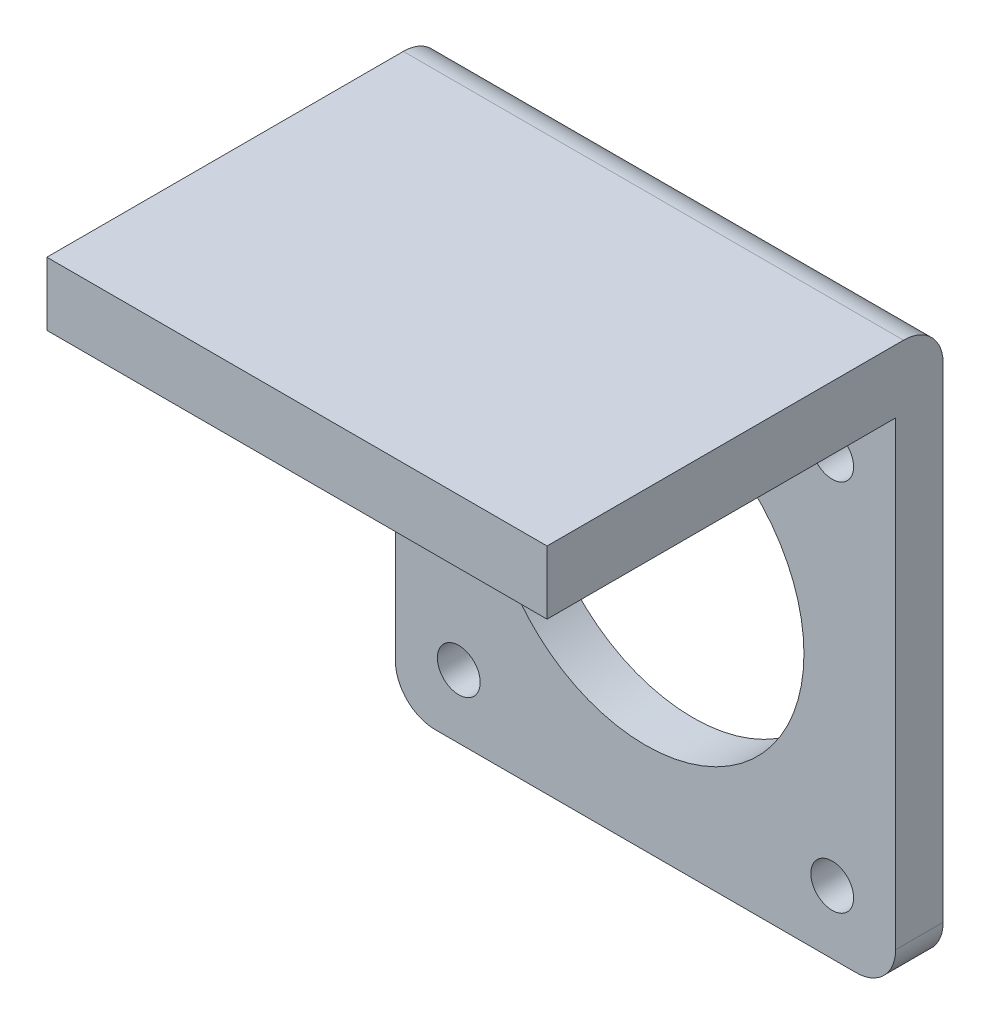
ISO-10303-21;
HEADER;
FILE_DESCRIPTION(('STEP AP214'),'2;1');
FILE_NAME('part.step','',(''),(''),'','','');
FILE_SCHEMA(('AUTOMOTIVE_DESIGN { 1 0 10303 214 1 1 1 1 }'));
ENDSEC;
DATA;
#1=APPLICATION_CONTEXT('core data for automotive mechanical design processes');
#2=APPLICATION_PROTOCOL_DEFINITION('international standard','automotive_design',2000,#1);
#3=PRODUCT_CONTEXT('',#1,'mechanical');
#4=PRODUCT('Part','Part','',(#3));
#5=PRODUCT_RELATED_PRODUCT_CATEGORY('part','',(#4));
#6=PRODUCT_DEFINITION_FORMATION('','',#4);
#7=PRODUCT_DEFINITION_CONTEXT('part definition',#1,'design');
#8=PRODUCT_DEFINITION('design','',#6,#7);
#9=PRODUCT_DEFINITION_SHAPE('','',#8);
#10=(LENGTH_UNIT() NAMED_UNIT(*) SI_UNIT(.MILLI.,.METRE.));
#11=(NAMED_UNIT(*) PLANE_ANGLE_UNIT() SI_UNIT($,.RADIAN.));
#12=(NAMED_UNIT(*) SI_UNIT($,.STERADIAN.) SOLID_ANGLE_UNIT());
#13=UNCERTAINTY_MEASURE_WITH_UNIT(LENGTH_MEASURE(1.E-05),#10,'distance_accuracy_value','');
#14=(GEOMETRIC_REPRESENTATION_CONTEXT(3) GLOBAL_UNCERTAINTY_ASSIGNED_CONTEXT((#13)) GLOBAL_UNIT_ASSIGNED_CONTEXT((#10,
#11,#12)) REPRESENTATION_CONTEXT('',''));
#15=CARTESIAN_POINT('',(0.,0.,0.));
#16=DIRECTION('',(0.,0.,1.));
#17=DIRECTION('',(1.,0.,0.));
#18=AXIS2_PLACEMENT_3D('',#15,#16,#17);
#19=CARTESIAN_POINT('',(-8.,0.,6.));
#20=DIRECTION('',(-1.,0.,0.));
#21=DIRECTION('',(0.,0.,1.));
#22=AXIS2_PLACEMENT_3D('',#19,#20,#21);
#23=PLANE('',#22);
#24=DIRECTION('',(0.,0.,-1.));
#25=VECTOR('',#24,1.);
#26=CARTESIAN_POINT('',(-8.,16.,50.));
#27=LINE('',#26,#25);
#28=CARTESIAN_POINT('',(-8.,16.,50.));
#29=VERTEX_POINT('',#28);
#30=CARTESIAN_POINT('',(-8.,16.,5.));
#31=VERTEX_POINT('',#30);
#32=EDGE_CURVE('E148',#29,#31,#27,.T.);
#33=ORIENTED_EDGE('',*,*,#32,.T.);
#34=CARTESIAN_POINT('',(-8.,11.,5.));
#35=DIRECTION('',(-1.,0.,0.));
#36=DIRECTION('',(0.,0.,1.));
#37=AXIS2_PLACEMENT_3D('',#34,#35,#36);
#38=CIRCLE('',#37,5.);
#39=CARTESIAN_POINT('',(-8.,11.,0.));
#40=VERTEX_POINT('',#39);
#41=EDGE_CURVE('E11',#31,#40,#38,.T.);
#42=ORIENTED_EDGE('',*,*,#41,.T.);
#43=DIRECTION('',(0.,1.,0.));
#44=VECTOR('',#43,1.);
#45=CARTESIAN_POINT('',(-8.,0.,0.));
#46=LINE('',#45,#44);
#47=CARTESIAN_POINT('',(-8.,-50.14,0.));
#48=VERTEX_POINT('',#47);
#49=EDGE_CURVE('E209',#48,#40,#46,.T.);
#50=ORIENTED_EDGE('',*,*,#49,.F.);
#51=DIRECTION('',(0.,0.,-1.));
#52=VECTOR('',#51,1.);
#53=CARTESIAN_POINT('',(-8.,-50.14,6.));
#54=LINE('',#53,#52);
#55=CARTESIAN_POINT('',(-8.,-50.14,6.));
#56=VERTEX_POINT('',#55);
#57=EDGE_CURVE('E240',#56,#48,#54,.T.);
#58=ORIENTED_EDGE('',*,*,#57,.F.);
#59=DIRECTION('',(0.,1.,0.));
#60=VECTOR('',#59,1.);
#61=CARTESIAN_POINT('',(-8.,0.,6.));
#62=LINE('',#61,#60);
#63=CARTESIAN_POINT('',(-8.,8.,6.));
#64=VERTEX_POINT('',#63);
#65=EDGE_CURVE('E170',#56,#64,#62,.T.);
#66=ORIENTED_EDGE('',*,*,#65,.T.);
#67=DIRECTION('',(0.,0.,-1.));
#68=VECTOR('',#67,1.);
#69=CARTESIAN_POINT('',(-8.,8.,50.));
#70=LINE('',#69,#68);
#71=CARTESIAN_POINT('',(-8.,8.,50.));
#72=VERTEX_POINT('',#71);
#73=EDGE_CURVE('E122',#72,#64,#70,.T.);
#74=ORIENTED_EDGE('',*,*,#73,.F.);
#75=DIRECTION('',(0.,1.,0.));
#76=VECTOR('',#75,1.);
#77=CARTESIAN_POINT('',(-8.,8.,50.));
#78=LINE('',#77,#76);
#79=EDGE_CURVE('E133',#72,#29,#78,.T.);
#80=ORIENTED_EDGE('',*,*,#79,.T.);
#81=EDGE_LOOP('',(#33,#42,#50,#58,#66,#74,#80));
#82=FACE_BOUND('',#81,.T.);
#83=ADVANCED_FACE('F41',(#82),#23,.T.);
#84=CARTESIAN_POINT('',(-3.,-50.14,6.));
#85=DIRECTION('',(0.,0.,-1.));
#86=DIRECTION('',(-1.,0.,0.));
#87=AXIS2_PLACEMENT_3D('',#84,#85,#86);
#88=CYLINDRICAL_SURFACE('',#87,5.);
#89=CARTESIAN_POINT('',(-3.,-50.14,0.));
#90=DIRECTION('',(0.,0.,1.));
#91=DIRECTION('',(1.,0.,0.));
#92=AXIS2_PLACEMENT_3D('',#89,#90,#91);
#93=CIRCLE('',#92,5.);
#94=CARTESIAN_POINT('',(-2.99999999999996,-55.14,0.));
#95=VERTEX_POINT('',#94);
#96=EDGE_CURVE('E213',#48,#95,#93,.T.);
#97=ORIENTED_EDGE('',*,*,#96,.T.);
#98=DIRECTION('',(0.,0.,-1.));
#99=VECTOR('',#98,1.);
#100=CARTESIAN_POINT('',(-2.99999999999996,-55.14,6.));
#101=LINE('',#100,#99);
#102=CARTESIAN_POINT('',(-2.99999999999996,-55.14,6.));
#103=VERTEX_POINT('',#102);
#104=EDGE_CURVE('E236',#103,#95,#101,.T.);
#105=ORIENTED_EDGE('',*,*,#104,.F.);
#106=CARTESIAN_POINT('',(-3.,-50.14,6.));
#107=DIRECTION('',(0.,0.,1.));
#108=DIRECTION('',(1.,0.,0.));
#109=AXIS2_PLACEMENT_3D('',#106,#107,#108);
#110=CIRCLE('',#109,5.);
#111=EDGE_CURVE('E173',#56,#103,#110,.T.);
#112=ORIENTED_EDGE('',*,*,#111,.F.);
#113=ORIENTED_EDGE('',*,*,#57,.T.);
#114=EDGE_LOOP('',(#97,#105,#112,#113));
#115=FACE_BOUND('',#114,.T.);
#116=ADVANCED_FACE('F268',(#115),#88,.T.);
#117=CARTESIAN_POINT('',(0.,-55.14,6.));
#118=DIRECTION('',(0.,1.,0.));
#119=DIRECTION('',(0.,0.,1.));
#120=AXIS2_PLACEMENT_3D('',#117,#118,#119);
#121=PLANE('',#120);
#122=DIRECTION('',(1.,0.,0.));
#123=VECTOR('',#122,1.);
#124=CARTESIAN_POINT('',(0.,-55.14,0.));
#125=LINE('',#124,#123);
#126=CARTESIAN_POINT('',(50.1400000000005,-55.14,0.));
#127=VERTEX_POINT('',#126);
#128=EDGE_CURVE('E217',#95,#127,#125,.T.);
#129=ORIENTED_EDGE('',*,*,#128,.T.);
#130=DIRECTION('',(0.,0.,-1.));
#131=VECTOR('',#130,1.);
#132=CARTESIAN_POINT('',(50.1400000000005,-55.14,6.));
#133=LINE('',#132,#131);
#134=CARTESIAN_POINT('',(50.1400000000005,-55.14,6.));
#135=VERTEX_POINT('',#134);
#136=EDGE_CURVE('E233',#135,#127,#133,.T.);
#137=ORIENTED_EDGE('',*,*,#136,.F.);
#138=DIRECTION('',(1.,0.,0.));
#139=VECTOR('',#138,1.);
#140=CARTESIAN_POINT('',(0.,-55.14,6.));
#141=LINE('',#140,#139);
#142=EDGE_CURVE('E177',#103,#135,#141,.T.);
#143=ORIENTED_EDGE('',*,*,#142,.F.);
#144=ORIENTED_EDGE('',*,*,#104,.T.);
#145=EDGE_LOOP('',(#129,#137,#143,#144));
#146=FACE_BOUND('',#145,.T.);
#147=ADVANCED_FACE('F265',(#146),#121,.F.);
#148=CARTESIAN_POINT('',(50.1400000000005,-50.14,6.));
#149=DIRECTION('',(0.,0.,-1.));
#150=DIRECTION('',(-1.,0.,0.));
#151=AXIS2_PLACEMENT_3D('',#148,#149,#150);
#152=CYLINDRICAL_SURFACE('',#151,5.);
#153=CARTESIAN_POINT('',(50.1400000000005,-50.14,0.));
#154=DIRECTION('',(0.,0.,1.));
#155=DIRECTION('',(1.,0.,0.));
#156=AXIS2_PLACEMENT_3D('',#153,#154,#155);
#157=CIRCLE('',#156,5.);
#158=CARTESIAN_POINT('',(55.1400000000005,-50.14,0.));
#159=VERTEX_POINT('',#158);
#160=EDGE_CURVE('E221',#159,#127,#157,.F.);
#161=ORIENTED_EDGE('',*,*,#160,.F.);
#162=DIRECTION('',(0.,0.,-1.));
#163=VECTOR('',#162,1.);
#164=CARTESIAN_POINT('',(55.1400000000005,-50.14,6.));
#165=LINE('',#164,#163);
#166=CARTESIAN_POINT('',(55.1400000000005,-50.14,6.));
#167=VERTEX_POINT('',#166);
#168=EDGE_CURVE('E193',#167,#159,#165,.T.);
#169=ORIENTED_EDGE('',*,*,#168,.F.);
#170=CARTESIAN_POINT('',(50.1400000000005,-50.14,6.));
#171=DIRECTION('',(0.,0.,1.));
#172=DIRECTION('',(1.,0.,0.));
#173=AXIS2_PLACEMENT_3D('',#170,#171,#172);
#174=CIRCLE('',#173,5.);
#175=EDGE_CURVE('E180',#167,#135,#174,.F.);
#176=ORIENTED_EDGE('',*,*,#175,.T.);
#177=ORIENTED_EDGE('',*,*,#136,.T.);
#178=EDGE_LOOP('',(#161,#169,#176,#177));
#179=FACE_BOUND('',#178,.T.);
#180=ADVANCED_FACE('F261',(#179),#152,.T.);
#181=CARTESIAN_POINT('',(55.1400000000005,0.,6.));
#182=DIRECTION('',(-1.,0.,0.));
#183=DIRECTION('',(0.,0.,1.));
#184=AXIS2_PLACEMENT_3D('',#181,#182,#183);
#185=PLANE('',#184);
#186=DIRECTION('',(0.,1.,0.));
#187=VECTOR('',#186,1.);
#188=CARTESIAN_POINT('',(55.1400000000005,0.,0.));
#189=LINE('',#188,#187);
#190=CARTESIAN_POINT('',(55.1400000000005,11.,0.));
#191=VERTEX_POINT('',#190);
#192=EDGE_CURVE('E225',#159,#191,#189,.T.);
#193=ORIENTED_EDGE('',*,*,#192,.T.);
#194=CARTESIAN_POINT('',(55.1400000000005,11.,5.));
#195=DIRECTION('',(-1.,0.,0.));
#196=DIRECTION('',(0.,0.,1.));
#197=AXIS2_PLACEMENT_3D('',#194,#195,#196);
#198=CIRCLE('',#197,5.);
#199=CARTESIAN_POINT('',(55.1400000000005,16.,5.));
#200=VERTEX_POINT('',#199);
#201=EDGE_CURVE('E64',#191,#200,#198,.F.);
#202=ORIENTED_EDGE('',*,*,#201,.T.);
#203=DIRECTION('',(0.,0.,-1.));
#204=VECTOR('',#203,1.);
#205=CARTESIAN_POINT('',(55.1400000000005,16.,50.));
#206=LINE('',#205,#204);
#207=CARTESIAN_POINT('',(55.1400000000005,16.,50.));
#208=VERTEX_POINT('',#207);
#209=EDGE_CURVE('E137',#208,#200,#206,.T.);
#210=ORIENTED_EDGE('',*,*,#209,.F.);
#211=DIRECTION('',(0.,-1.,0.));
#212=VECTOR('',#211,1.);
#213=CARTESIAN_POINT('',(55.1400000000005,8.,50.));
#214=LINE('',#213,#212);
#215=CARTESIAN_POINT('',(55.1400000000005,8.,50.));
#216=VERTEX_POINT('',#215);
#217=EDGE_CURVE('E130',#208,#216,#214,.T.);
#218=ORIENTED_EDGE('',*,*,#217,.T.);
#219=DIRECTION('',(0.,0.,-1.));
#220=VECTOR('',#219,1.);
#221=CARTESIAN_POINT('',(55.1400000000005,8.,50.));
#222=LINE('',#221,#220);
#223=CARTESIAN_POINT('',(55.1400000000005,8.,6.));
#224=VERTEX_POINT('',#223);
#225=EDGE_CURVE('E112',#216,#224,#222,.T.);
#226=ORIENTED_EDGE('',*,*,#225,.T.);
#227=DIRECTION('',(0.,1.,0.));
#228=VECTOR('',#227,1.);
#229=CARTESIAN_POINT('',(55.1400000000005,0.,6.));
#230=LINE('',#229,#228);
#231=EDGE_CURVE('E184',#167,#224,#230,.T.);
#232=ORIENTED_EDGE('',*,*,#231,.F.);
#233=ORIENTED_EDGE('',*,*,#168,.T.);
#234=EDGE_LOOP('',(#193,#202,#210,#218,#226,#232,#233));
#235=FACE_BOUND('',#234,.T.);
#236=ADVANCED_FACE('F136',(#235),#185,.F.);
#237=CARTESIAN_POINT('',(47.1400000000005,-47.14,6.));
#238=DIRECTION('',(0.,0.,-1.));
#239=DIRECTION('',(-1.,0.,0.));
#240=AXIS2_PLACEMENT_3D('',#237,#238,#239);
#241=CYLINDRICAL_SURFACE('',#240,2.7);
#242=CARTESIAN_POINT('',(47.1400000000005,-47.14,6.));
#243=DIRECTION('',(0.,0.,1.));
#244=DIRECTION('',(1.,0.,0.));
#245=AXIS2_PLACEMENT_3D('',#242,#243,#244);
#246=CIRCLE('',#245,2.7);
#247=CARTESIAN_POINT('',(49.8400000000005,-47.14,6.));
#248=VERTEX_POINT('',#247);
#249=EDGE_CURVE('E166',#248,#248,#246,.T.);
#250=ORIENTED_EDGE('',*,*,#249,.T.);
#251=EDGE_LOOP('',(#250));
#252=FACE_BOUND('',#251,.T.);
#253=CARTESIAN_POINT('',(47.1400000000005,-47.14,0.));
#254=DIRECTION('',(0.,0.,1.));
#255=DIRECTION('',(1.,0.,0.));
#256=AXIS2_PLACEMENT_3D('',#253,#254,#255);
#257=CIRCLE('',#256,2.7);
#258=CARTESIAN_POINT('',(49.8400000000005,-47.14,0.));
#259=VERTEX_POINT('',#258);
#260=EDGE_CURVE('E205',#259,#259,#257,.T.);
#261=ORIENTED_EDGE('',*,*,#260,.F.);
#262=EDGE_LOOP('',(#261));
#263=FACE_BOUND('',#262,.T.);
#264=ADVANCED_FACE('F284',(#252,#263),#241,.F.);
#265=CARTESIAN_POINT('',(4.90878798433606E-13,-47.14,6.));
#266=DIRECTION('',(0.,0.,-1.));
#267=DIRECTION('',(-1.,0.,0.));
#268=AXIS2_PLACEMENT_3D('',#265,#266,#267);
#269=CYLINDRICAL_SURFACE('',#268,2.7);
#270=CARTESIAN_POINT('',(4.90878798433606E-13,-47.14,6.));
#271=DIRECTION('',(0.,0.,1.));
#272=DIRECTION('',(1.,0.,0.));
#273=AXIS2_PLACEMENT_3D('',#270,#271,#272);
#274=CIRCLE('',#273,2.7);
#275=CARTESIAN_POINT('',(2.70000000000049,-47.14,6.));
#276=VERTEX_POINT('',#275);
#277=EDGE_CURVE('E162',#276,#276,#274,.T.);
#278=ORIENTED_EDGE('',*,*,#277,.T.);
#279=EDGE_LOOP('',(#278));
#280=FACE_BOUND('',#279,.T.);
#281=CARTESIAN_POINT('',(4.90878798433606E-13,-47.14,0.));
#282=DIRECTION('',(0.,0.,1.));
#283=DIRECTION('',(1.,0.,0.));
#284=AXIS2_PLACEMENT_3D('',#281,#282,#283);
#285=CIRCLE('',#284,2.7);
#286=CARTESIAN_POINT('',(2.70000000000049,-47.14,0.));
#287=VERTEX_POINT('',#286);
#288=EDGE_CURVE('E201',#287,#287,#285,.T.);
#289=ORIENTED_EDGE('',*,*,#288,.F.);
#290=EDGE_LOOP('',(#289));
#291=FACE_BOUND('',#290,.T.);
#292=ADVANCED_FACE('F287',(#280,#291),#269,.F.);
#293=CARTESIAN_POINT('',(47.14,0.,6.));
#294=DIRECTION('',(0.,0.,-1.));
#295=DIRECTION('',(-1.,0.,0.));
#296=AXIS2_PLACEMENT_3D('',#293,#294,#295);
#297=CYLINDRICAL_SURFACE('',#296,2.7);
#298=CARTESIAN_POINT('',(47.14,0.,6.));
#299=DIRECTION('',(0.,0.,1.));
#300=DIRECTION('',(1.,0.,0.));
#301=AXIS2_PLACEMENT_3D('',#298,#299,#300);
#302=CIRCLE('',#301,2.7);
#303=CARTESIAN_POINT('',(49.84,0.,6.));
#304=VERTEX_POINT('',#303);
#305=EDGE_CURVE('E157',#304,#304,#302,.T.);
#306=ORIENTED_EDGE('',*,*,#305,.T.);
#307=EDGE_LOOP('',(#306));
#308=FACE_BOUND('',#307,.T.);
#309=CARTESIAN_POINT('',(47.14,0.,0.));
#310=DIRECTION('',(0.,0.,1.));
#311=DIRECTION('',(1.,0.,0.));
#312=AXIS2_PLACEMENT_3D('',#309,#310,#311);
#313=CIRCLE('',#312,2.7);
#314=CARTESIAN_POINT('',(49.84,0.,0.));
#315=VERTEX_POINT('',#314);
#316=EDGE_CURVE('E197',#315,#315,#313,.T.);
#317=ORIENTED_EDGE('',*,*,#316,.F.);
#318=EDGE_LOOP('',(#317));
#319=FACE_BOUND('',#318,.T.);
#320=ADVANCED_FACE('F291',(#308,#319),#297,.F.);
#321=CARTESIAN_POINT('',(0.,0.,6.));
#322=DIRECTION('',(0.,0.,-1.));
#323=DIRECTION('',(-1.,0.,0.));
#324=AXIS2_PLACEMENT_3D('',#321,#322,#323);
#325=CYLINDRICAL_SURFACE('',#324,2.7);
#326=CARTESIAN_POINT('',(0.,0.,6.));
#327=DIRECTION('',(0.,0.,1.));
#328=DIRECTION('',(1.,0.,0.));
#329=AXIS2_PLACEMENT_3D('',#326,#327,#328);
#330=CIRCLE('',#329,2.7);
#331=CARTESIAN_POINT('',(2.7,0.,6.));
#332=VERTEX_POINT('',#331);
#333=EDGE_CURVE('E153',#332,#332,#330,.T.);
#334=ORIENTED_EDGE('',*,*,#333,.T.);
#335=EDGE_LOOP('',(#334));
#336=FACE_BOUND('',#335,.T.);
#337=CARTESIAN_POINT('',(0.,0.,0.));
#338=DIRECTION('',(0.,0.,1.));
#339=DIRECTION('',(1.,0.,0.));
#340=AXIS2_PLACEMENT_3D('',#337,#338,#339);
#341=CIRCLE('',#340,2.7);
#342=CARTESIAN_POINT('',(2.7,0.,0.));
#343=VERTEX_POINT('',#342);
#344=EDGE_CURVE('E147',#343,#343,#341,.T.);
#345=ORIENTED_EDGE('',*,*,#344,.F.);
#346=EDGE_LOOP('',(#345));
#347=FACE_BOUND('',#346,.T.);
#348=ADVANCED_FACE('F294',(#336,#347),#325,.F.);
#349=CARTESIAN_POINT('',(23.5700000000002,-23.57,6.));
#350=DIRECTION('',(0.,0.,-1.));
#351=DIRECTION('',(-1.,0.,0.));
#352=AXIS2_PLACEMENT_3D('',#349,#350,#351);
#353=CYLINDRICAL_SURFACE('',#352,20.);
#354=CARTESIAN_POINT('',(23.5700000000002,-23.57,6.));
#355=DIRECTION('',(0.,0.,1.));
#356=DIRECTION('',(1.,0.,0.));
#357=AXIS2_PLACEMENT_3D('',#354,#355,#356);
#358=CIRCLE('',#357,20.);
#359=CARTESIAN_POINT('',(43.5700000000002,-23.57,6.));
#360=VERTEX_POINT('',#359);
#361=EDGE_CURVE('E189',#360,#360,#358,.T.);
#362=ORIENTED_EDGE('',*,*,#361,.T.);
#363=EDGE_LOOP('',(#362));
#364=FACE_BOUND('',#363,.T.);
#365=CARTESIAN_POINT('',(23.5700000000002,-23.57,0.));
#366=DIRECTION('',(0.,0.,1.));
#367=DIRECTION('',(1.,0.,0.));
#368=AXIS2_PLACEMENT_3D('',#365,#366,#367);
#369=CIRCLE('',#368,20.);
#370=CARTESIAN_POINT('',(43.5700000000002,-23.57,0.));
#371=VERTEX_POINT('',#370);
#372=EDGE_CURVE('E158',#371,#371,#369,.T.);
#373=ORIENTED_EDGE('',*,*,#372,.F.);
#374=EDGE_LOOP('',(#373));
#375=FACE_BOUND('',#374,.T.);
#376=ADVANCED_FACE('F297',(#364,#375),#353,.F.);
#377=CARTESIAN_POINT('',(0.,0.,6.));
#378=DIRECTION('',(0.,0.,1.));
#379=DIRECTION('',(1.,0.,0.));
#380=AXIS2_PLACEMENT_3D('',#377,#378,#379);
#381=PLANE('',#380);
#382=ORIENTED_EDGE('',*,*,#333,.F.);
#383=EDGE_LOOP('',(#382));
#384=FACE_BOUND('',#383,.T.);
#385=ORIENTED_EDGE('',*,*,#305,.F.);
#386=EDGE_LOOP('',(#385));
#387=FACE_BOUND('',#386,.T.);
#388=ORIENTED_EDGE('',*,*,#277,.F.);
#389=EDGE_LOOP('',(#388));
#390=FACE_BOUND('',#389,.T.);
#391=ORIENTED_EDGE('',*,*,#249,.F.);
#392=EDGE_LOOP('',(#391));
#393=FACE_BOUND('',#392,.T.);
#394=ORIENTED_EDGE('',*,*,#65,.F.);
#395=ORIENTED_EDGE('',*,*,#111,.T.);
#396=ORIENTED_EDGE('',*,*,#142,.T.);
#397=ORIENTED_EDGE('',*,*,#175,.F.);
#398=ORIENTED_EDGE('',*,*,#231,.T.);
#399=DIRECTION('',(1.,0.,0.));
#400=VECTOR('',#399,1.);
#401=CARTESIAN_POINT('',(0.,8.,6.));
#402=LINE('',#401,#400);
#403=EDGE_CURVE('E118',#64,#224,#402,.T.);
#404=ORIENTED_EDGE('',*,*,#403,.F.);
#405=EDGE_LOOP('',(#394,#395,#396,#397,#398,#404));
#406=FACE_BOUND('',#405,.T.);
#407=ORIENTED_EDGE('',*,*,#361,.F.);
#408=EDGE_LOOP('',(#407));
#409=FACE_BOUND('',#408,.T.);
#410=ADVANCED_FACE('F302',(#384,#387,#390,#393,#406,#409),#381,.T.);
#411=CARTESIAN_POINT('',(0.,0.,0.));
#412=DIRECTION('',(0.,0.,1.));
#413=DIRECTION('',(1.,0.,0.));
#414=AXIS2_PLACEMENT_3D('',#411,#412,#413);
#415=PLANE('',#414);
#416=ORIENTED_EDGE('',*,*,#344,.T.);
#417=EDGE_LOOP('',(#416));
#418=FACE_BOUND('',#417,.T.);
#419=ORIENTED_EDGE('',*,*,#316,.T.);
#420=EDGE_LOOP('',(#419));
#421=FACE_BOUND('',#420,.T.);
#422=ORIENTED_EDGE('',*,*,#288,.T.);
#423=EDGE_LOOP('',(#422));
#424=FACE_BOUND('',#423,.T.);
#425=ORIENTED_EDGE('',*,*,#260,.T.);
#426=EDGE_LOOP('',(#425));
#427=FACE_BOUND('',#426,.T.);
#428=ORIENTED_EDGE('',*,*,#49,.T.);
#429=DIRECTION('',(1.,0.,0.));
#430=VECTOR('',#429,1.);
#431=CARTESIAN_POINT('',(55.1400000000005,11.,0.));
#432=LINE('',#431,#430);
#433=EDGE_CURVE('E243',#40,#191,#432,.T.);
#434=ORIENTED_EDGE('',*,*,#433,.T.);
#435=ORIENTED_EDGE('',*,*,#192,.F.);
#436=ORIENTED_EDGE('',*,*,#160,.T.);
#437=ORIENTED_EDGE('',*,*,#128,.F.);
#438=ORIENTED_EDGE('',*,*,#96,.F.);
#439=EDGE_LOOP('',(#428,#434,#435,#436,#437,#438));
#440=FACE_BOUND('',#439,.T.);
#441=ORIENTED_EDGE('',*,*,#372,.T.);
#442=EDGE_LOOP('',(#441));
#443=FACE_BOUND('',#442,.T.);
#444=ADVANCED_FACE('F252',(#418,#421,#424,#427,#440,#443),#415,.F.);
#445=CARTESIAN_POINT('',(55.1400000000005,16.,50.));
#446=DIRECTION('',(0.,1.,0.));
#447=DIRECTION('',(0.,0.,1.));
#448=AXIS2_PLACEMENT_3D('',#445,#446,#447);
#449=PLANE('',#448);
#450=ORIENTED_EDGE('',*,*,#209,.T.);
#451=DIRECTION('',(1.,0.,0.));
#452=VECTOR('',#451,1.);
#453=CARTESIAN_POINT('',(-8.,16.,5.));
#454=LINE('',#453,#452);
#455=EDGE_CURVE('E50',#200,#31,#454,.F.);
#456=ORIENTED_EDGE('',*,*,#455,.T.);
#457=ORIENTED_EDGE('',*,*,#32,.F.);
#458=DIRECTION('',(1.,0.,0.));
#459=VECTOR('',#458,1.);
#460=CARTESIAN_POINT('',(55.1400000000005,16.,50.));
#461=LINE('',#460,#459);
#462=EDGE_CURVE('E123',#29,#208,#461,.T.);
#463=ORIENTED_EDGE('',*,*,#462,.T.);
#464=EDGE_LOOP('',(#450,#456,#457,#463));
#465=FACE_BOUND('',#464,.T.);
#466=ADVANCED_FACE('F311',(#465),#449,.T.);
#467=CARTESIAN_POINT('',(55.1400000000005,8.,50.));
#468=DIRECTION('',(0.,-1.,0.));
#469=DIRECTION('',(0.,0.,-1.));
#470=AXIS2_PLACEMENT_3D('',#467,#468,#469);
#471=PLANE('',#470);
#472=ORIENTED_EDGE('',*,*,#73,.T.);
#473=ORIENTED_EDGE('',*,*,#403,.T.);
#474=ORIENTED_EDGE('',*,*,#225,.F.);
#475=DIRECTION('',(-1.,0.,0.));
#476=VECTOR('',#475,1.);
#477=CARTESIAN_POINT('',(55.1400000000005,8.,50.));
#478=LINE('',#477,#476);
#479=EDGE_CURVE('E116',#216,#72,#478,.T.);
#480=ORIENTED_EDGE('',*,*,#479,.T.);
#481=EDGE_LOOP('',(#472,#473,#474,#480));
#482=FACE_BOUND('',#481,.T.);
#483=ADVANCED_FACE('F115',(#482),#471,.T.);
#484=CARTESIAN_POINT('',(0.,0.,50.));
#485=DIRECTION('',(0.,0.,1.));
#486=DIRECTION('',(1.,0.,0.));
#487=AXIS2_PLACEMENT_3D('',#484,#485,#486);
#488=PLANE('',#487);
#489=ORIENTED_EDGE('',*,*,#217,.F.);
#490=ORIENTED_EDGE('',*,*,#462,.F.);
#491=ORIENTED_EDGE('',*,*,#79,.F.);
#492=ORIENTED_EDGE('',*,*,#479,.F.);
#493=EDGE_LOOP('',(#489,#490,#491,#492));
#494=FACE_BOUND('',#493,.T.);
#495=ADVANCED_FACE('F128',(#494),#488,.T.);
#496=CARTESIAN_POINT('',(0.,11.,5.));
#497=DIRECTION('',(-1.,0.,0.));
#498=DIRECTION('',(0.,0.,1.));
#499=AXIS2_PLACEMENT_3D('',#496,#497,#498);
#500=CYLINDRICAL_SURFACE('',#499,5.);
#501=ORIENTED_EDGE('',*,*,#41,.F.);
#502=ORIENTED_EDGE('',*,*,#455,.F.);
#503=ORIENTED_EDGE('',*,*,#201,.F.);
#504=ORIENTED_EDGE('',*,*,#433,.F.);
#505=EDGE_LOOP('',(#501,#502,#503,#504));
#506=FACE_BOUND('',#505,.T.);
#507=ADVANCED_FACE('F43',(#506),#500,.T.);
#508=CLOSED_SHELL('',(#83,#116,#147,#180,#236,#264,#292,#320,#348,#376,#410,#444,#466,#483,#495,#507));
#509=MANIFOLD_SOLID_BREP('B2',#508);
#510=ADVANCED_BREP_SHAPE_REPRESENTATION('',(#18,#509),#14);
#511=SHAPE_DEFINITION_REPRESENTATION(#9,#510);
ENDSEC;
END-ISO-10303-21;
